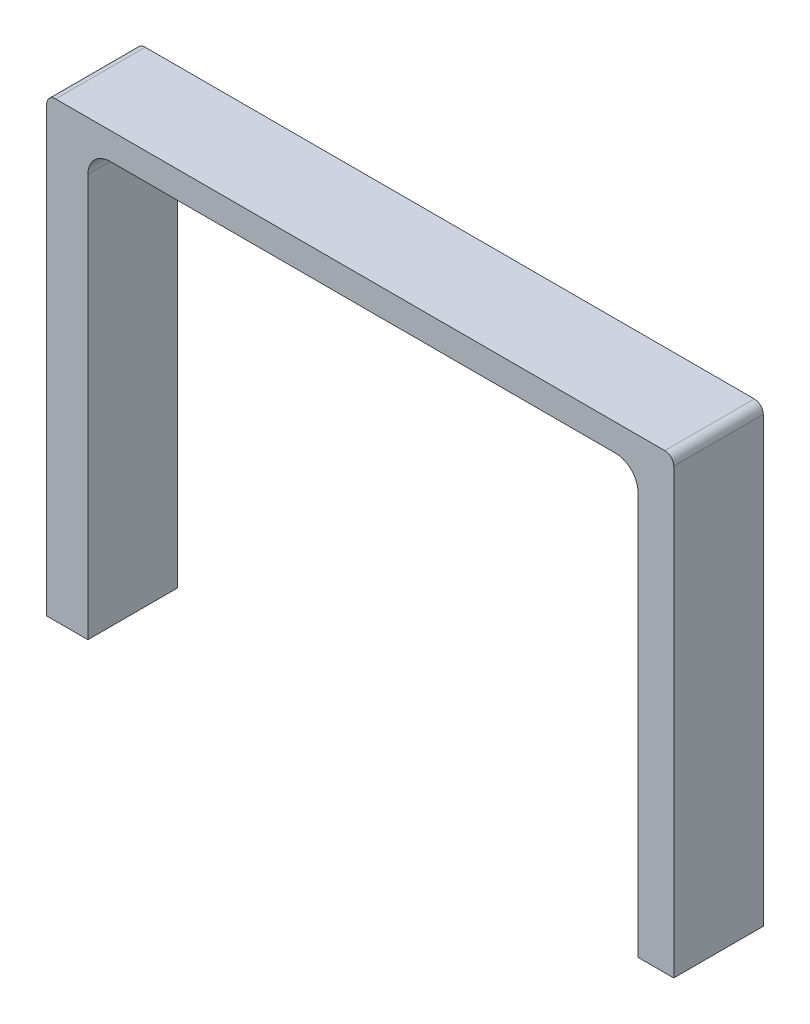
ISO-10303-21;
HEADER;
FILE_DESCRIPTION(('STEP AP214'),'2;1');
FILE_NAME('part.step','',(''),(''),'','','');
FILE_SCHEMA(('AUTOMOTIVE_DESIGN { 1 0 10303 214 1 1 1 1 }'));
ENDSEC;
DATA;
#1=APPLICATION_CONTEXT('core data for automotive mechanical design processes');
#2=APPLICATION_PROTOCOL_DEFINITION('international standard','automotive_design',2000,#1);
#3=PRODUCT_CONTEXT('',#1,'mechanical');
#4=PRODUCT('Part','Part','',(#3));
#5=PRODUCT_RELATED_PRODUCT_CATEGORY('part','',(#4));
#6=PRODUCT_DEFINITION_FORMATION('','',#4);
#7=PRODUCT_DEFINITION_CONTEXT('part definition',#1,'design');
#8=PRODUCT_DEFINITION('design','',#6,#7);
#9=PRODUCT_DEFINITION_SHAPE('','',#8);
#10=(LENGTH_UNIT() NAMED_UNIT(*) SI_UNIT(.MILLI.,.METRE.));
#11=(NAMED_UNIT(*) PLANE_ANGLE_UNIT() SI_UNIT($,.RADIAN.));
#12=(NAMED_UNIT(*) SI_UNIT($,.STERADIAN.) SOLID_ANGLE_UNIT());
#13=UNCERTAINTY_MEASURE_WITH_UNIT(LENGTH_MEASURE(1.E-05),#10,'distance_accuracy_value','');
#14=(GEOMETRIC_REPRESENTATION_CONTEXT(3) GLOBAL_UNCERTAINTY_ASSIGNED_CONTEXT((#13)) GLOBAL_UNIT_ASSIGNED_CONTEXT((#10,
#11,#12)) REPRESENTATION_CONTEXT('',''));
#15=CARTESIAN_POINT('',(0.,0.,0.));
#16=DIRECTION('',(0.,0.,1.));
#17=DIRECTION('',(1.,0.,0.));
#18=AXIS2_PLACEMENT_3D('',#15,#16,#17);
#19=CARTESIAN_POINT('',(88.9254,64.135,25.4));
#20=DIRECTION('',(-1.,0.,0.));
#21=DIRECTION('',(0.,-1.,0.));
#22=AXIS2_PLACEMENT_3D('',#19,#20,#21);
#23=PLANE('',#22);
#24=DIRECTION('',(0.,1.,0.));
#25=VECTOR('',#24,1.);
#26=CARTESIAN_POINT('',(88.9254,64.135,0.));
#27=LINE('',#26,#25);
#28=CARTESIAN_POINT('',(88.9254,-64.135,0.));
#29=VERTEX_POINT('',#28);
#30=CARTESIAN_POINT('',(88.9254,61.595,0.));
#31=VERTEX_POINT('',#30);
#32=EDGE_CURVE('E166',#29,#31,#27,.T.);
#33=ORIENTED_EDGE('',*,*,#32,.T.);
#34=DIRECTION('',(0.,0.,-1.));
#35=VECTOR('',#34,1.);
#36=CARTESIAN_POINT('',(88.9254,61.595,25.4));
#37=LINE('',#36,#35);
#38=CARTESIAN_POINT('',(88.9254,61.595,25.4));
#39=VERTEX_POINT('',#38);
#40=EDGE_CURVE('E11',#31,#39,#37,.F.);
#41=ORIENTED_EDGE('',*,*,#40,.T.);
#42=DIRECTION('',(0.,1.,0.));
#43=VECTOR('',#42,1.);
#44=CARTESIAN_POINT('',(88.9254,64.135,25.4));
#45=LINE('',#44,#43);
#46=CARTESIAN_POINT('',(88.9254,-64.135,25.4));
#47=VERTEX_POINT('',#46);
#48=EDGE_CURVE('E183',#47,#39,#45,.T.);
#49=ORIENTED_EDGE('',*,*,#48,.F.);
#50=DIRECTION('',(0.,0.,-1.));
#51=VECTOR('',#50,1.);
#52=CARTESIAN_POINT('',(88.9254,-64.135,25.4));
#53=LINE('',#52,#51);
#54=EDGE_CURVE('E165',#47,#29,#53,.T.);
#55=ORIENTED_EDGE('',*,*,#54,.T.);
#56=EDGE_LOOP('',(#33,#41,#49,#55));
#57=FACE_BOUND('',#56,.T.);
#58=ADVANCED_FACE('F37',(#57),#23,.F.);
#59=CARTESIAN_POINT('',(-88.9254,64.135,25.4));
#60=DIRECTION('',(0.,-1.,0.));
#61=DIRECTION('',(0.,0.,-1.));
#62=AXIS2_PLACEMENT_3D('',#59,#60,#61);
#63=PLANE('',#62);
#64=DIRECTION('',(-1.,0.,0.));
#65=VECTOR('',#64,1.);
#66=CARTESIAN_POINT('',(-88.9254,64.135,0.));
#67=LINE('',#66,#65);
#68=CARTESIAN_POINT('',(86.3854,64.135,0.));
#69=VERTEX_POINT('',#68);
#70=CARTESIAN_POINT('',(-86.3854,64.135,0.));
#71=VERTEX_POINT('',#70);
#72=EDGE_CURVE('E168',#69,#71,#67,.T.);
#73=ORIENTED_EDGE('',*,*,#72,.T.);
#74=DIRECTION('',(0.,0.,-1.));
#75=VECTOR('',#74,1.);
#76=CARTESIAN_POINT('',(-86.3854,64.135,25.4));
#77=LINE('',#76,#75);
#78=CARTESIAN_POINT('',(-86.3854,64.135,25.4));
#79=VERTEX_POINT('',#78);
#80=EDGE_CURVE('E58',#71,#79,#77,.F.);
#81=ORIENTED_EDGE('',*,*,#80,.T.);
#82=DIRECTION('',(-1.,0.,0.));
#83=VECTOR('',#82,1.);
#84=CARTESIAN_POINT('',(-88.9254,64.135,25.4));
#85=LINE('',#84,#83);
#86=CARTESIAN_POINT('',(86.3854,64.135,25.4));
#87=VERTEX_POINT('',#86);
#88=EDGE_CURVE('E138',#87,#79,#85,.T.);
#89=ORIENTED_EDGE('',*,*,#88,.F.);
#90=DIRECTION('',(0.,0.,-1.));
#91=VECTOR('',#90,1.);
#92=CARTESIAN_POINT('',(86.3854,64.135,25.4));
#93=LINE('',#92,#91);
#94=EDGE_CURVE('E213',#87,#69,#93,.T.);
#95=ORIENTED_EDGE('',*,*,#94,.T.);
#96=EDGE_LOOP('',(#73,#81,#89,#95));
#97=FACE_BOUND('',#96,.T.);
#98=ADVANCED_FACE('F221',(#97),#63,.F.);
#99=CARTESIAN_POINT('',(-88.9254,64.135,25.4));
#100=DIRECTION('',(1.,0.,0.));
#101=DIRECTION('',(0.,1.,0.));
#102=AXIS2_PLACEMENT_3D('',#99,#100,#101);
#103=PLANE('',#102);
#104=DIRECTION('',(0.,-1.,0.));
#105=VECTOR('',#104,1.);
#106=CARTESIAN_POINT('',(-88.9254,64.135,25.4));
#107=LINE('',#106,#105);
#108=CARTESIAN_POINT('',(-88.9254,61.595,25.4));
#109=VERTEX_POINT('',#108);
#110=CARTESIAN_POINT('',(-88.9254,-64.135,25.4));
#111=VERTEX_POINT('',#110);
#112=EDGE_CURVE('E127',#109,#111,#107,.T.);
#113=ORIENTED_EDGE('',*,*,#112,.F.);
#114=DIRECTION('',(0.,0.,-1.));
#115=VECTOR('',#114,1.);
#116=CARTESIAN_POINT('',(-88.9254,61.595,25.4));
#117=LINE('',#116,#115);
#118=CARTESIAN_POINT('',(-88.9254,61.595,0.));
#119=VERTEX_POINT('',#118);
#120=EDGE_CURVE('E207',#109,#119,#117,.T.);
#121=ORIENTED_EDGE('',*,*,#120,.T.);
#122=DIRECTION('',(0.,-1.,0.));
#123=VECTOR('',#122,1.);
#124=CARTESIAN_POINT('',(-88.9254,64.135,0.));
#125=LINE('',#124,#123);
#126=CARTESIAN_POINT('',(-88.9254,-64.135,0.));
#127=VERTEX_POINT('',#126);
#128=EDGE_CURVE('E144',#119,#127,#125,.T.);
#129=ORIENTED_EDGE('',*,*,#128,.T.);
#130=DIRECTION('',(0.,0.,-1.));
#131=VECTOR('',#130,1.);
#132=CARTESIAN_POINT('',(-88.9254,-64.135,25.4));
#133=LINE('',#132,#131);
#134=EDGE_CURVE('E141',#111,#127,#133,.T.);
#135=ORIENTED_EDGE('',*,*,#134,.F.);
#136=EDGE_LOOP('',(#113,#121,#129,#135));
#137=FACE_BOUND('',#136,.T.);
#138=ADVANCED_FACE('F142',(#137),#103,.F.);
#139=CARTESIAN_POINT('',(-88.9254,-64.135,25.4));
#140=DIRECTION('',(0.,1.,0.));
#141=DIRECTION('',(-1.,0.,0.));
#142=AXIS2_PLACEMENT_3D('',#139,#140,#141);
#143=PLANE('',#142);
#144=DIRECTION('',(1.,0.,0.));
#145=VECTOR('',#144,1.);
#146=CARTESIAN_POINT('',(-88.9254,-64.135,0.));
#147=LINE('',#146,#145);
#148=CARTESIAN_POINT('',(-77.2414,-64.135,0.));
#149=VERTEX_POINT('',#148);
#150=EDGE_CURVE('E171',#127,#149,#147,.T.);
#151=ORIENTED_EDGE('',*,*,#150,.T.);
#152=DIRECTION('',(0.,0.,-1.));
#153=VECTOR('',#152,1.);
#154=CARTESIAN_POINT('',(-77.2414,-64.135,25.4));
#155=LINE('',#154,#153);
#156=CARTESIAN_POINT('',(-77.2414,-64.135,25.4));
#157=VERTEX_POINT('',#156);
#158=EDGE_CURVE('E148',#157,#149,#155,.T.);
#159=ORIENTED_EDGE('',*,*,#158,.F.);
#160=DIRECTION('',(1.,0.,0.));
#161=VECTOR('',#160,1.);
#162=CARTESIAN_POINT('',(-88.9254,-64.135,25.4));
#163=LINE('',#162,#161);
#164=EDGE_CURVE('E132',#111,#157,#163,.T.);
#165=ORIENTED_EDGE('',*,*,#164,.F.);
#166=ORIENTED_EDGE('',*,*,#134,.T.);
#167=EDGE_LOOP('',(#151,#159,#165,#166));
#168=FACE_BOUND('',#167,.T.);
#169=ADVANCED_FACE('F150',(#168),#143,.F.);
#170=CARTESIAN_POINT('',(-77.2414,56.515,25.4));
#171=DIRECTION('',(-1.,0.,0.));
#172=DIRECTION('',(0.,-1.,0.));
#173=AXIS2_PLACEMENT_3D('',#170,#171,#172);
#174=PLANE('',#173);
#175=DIRECTION('',(0.,1.,0.));
#176=VECTOR('',#175,1.);
#177=CARTESIAN_POINT('',(-77.2414,56.515,0.));
#178=LINE('',#177,#176);
#179=CARTESIAN_POINT('',(-77.2414,50.165,0.));
#180=VERTEX_POINT('',#179);
#181=EDGE_CURVE('E173',#149,#180,#178,.T.);
#182=ORIENTED_EDGE('',*,*,#181,.T.);
#183=DIRECTION('',(0.,0.,-1.));
#184=VECTOR('',#183,1.);
#185=CARTESIAN_POINT('',(-77.2414,50.165,25.4));
#186=LINE('',#185,#184);
#187=CARTESIAN_POINT('',(-77.2414,50.165,25.4));
#188=VERTEX_POINT('',#187);
#189=EDGE_CURVE('E194',#180,#188,#186,.F.);
#190=ORIENTED_EDGE('',*,*,#189,.T.);
#191=DIRECTION('',(0.,1.,0.));
#192=VECTOR('',#191,1.);
#193=CARTESIAN_POINT('',(-77.2414,56.515,25.4));
#194=LINE('',#193,#192);
#195=EDGE_CURVE('E153',#157,#188,#194,.T.);
#196=ORIENTED_EDGE('',*,*,#195,.F.);
#197=ORIENTED_EDGE('',*,*,#158,.T.);
#198=EDGE_LOOP('',(#182,#190,#196,#197));
#199=FACE_BOUND('',#198,.T.);
#200=ADVANCED_FACE('F252',(#199),#174,.F.);
#201=CARTESIAN_POINT('',(78.7654,56.515,25.4));
#202=DIRECTION('',(0.,1.,0.));
#203=DIRECTION('',(-1.,0.,0.));
#204=AXIS2_PLACEMENT_3D('',#201,#202,#203);
#205=PLANE('',#204);
#206=DIRECTION('',(1.,0.,0.));
#207=VECTOR('',#206,1.);
#208=CARTESIAN_POINT('',(78.7654,56.515,25.4));
#209=LINE('',#208,#207);
#210=CARTESIAN_POINT('',(-70.8914,56.515,25.4));
#211=VERTEX_POINT('',#210);
#212=CARTESIAN_POINT('',(72.4154,56.515,25.4));
#213=VERTEX_POINT('',#212);
#214=EDGE_CURVE('E155',#211,#213,#209,.T.);
#215=ORIENTED_EDGE('',*,*,#214,.F.);
#216=DIRECTION('',(0.,0.,-1.));
#217=VECTOR('',#216,1.);
#218=CARTESIAN_POINT('',(-70.8914,56.515,0.));
#219=LINE('',#218,#217);
#220=CARTESIAN_POINT('',(-70.8914,56.515,0.));
#221=VERTEX_POINT('',#220);
#222=EDGE_CURVE('E191',#211,#221,#219,.T.);
#223=ORIENTED_EDGE('',*,*,#222,.T.);
#224=DIRECTION('',(1.,0.,0.));
#225=VECTOR('',#224,1.);
#226=CARTESIAN_POINT('',(78.7654,56.515,0.));
#227=LINE('',#226,#225);
#228=CARTESIAN_POINT('',(72.4154,56.515,0.));
#229=VERTEX_POINT('',#228);
#230=EDGE_CURVE('E176',#221,#229,#227,.T.);
#231=ORIENTED_EDGE('',*,*,#230,.T.);
#232=DIRECTION('',(0.,0.,-1.));
#233=VECTOR('',#232,1.);
#234=CARTESIAN_POINT('',(72.4154,56.515,25.4));
#235=LINE('',#234,#233);
#236=EDGE_CURVE('E147',#229,#213,#235,.F.);
#237=ORIENTED_EDGE('',*,*,#236,.T.);
#238=EDGE_LOOP('',(#215,#223,#231,#237));
#239=FACE_BOUND('',#238,.T.);
#240=ADVANCED_FACE('F244',(#239),#205,.F.);
#241=CARTESIAN_POINT('',(78.7654,56.515,25.4));
#242=DIRECTION('',(1.,0.,0.));
#243=DIRECTION('',(0.,1.,0.));
#244=AXIS2_PLACEMENT_3D('',#241,#242,#243);
#245=PLANE('',#244);
#246=DIRECTION('',(0.,-1.,0.));
#247=VECTOR('',#246,1.);
#248=CARTESIAN_POINT('',(78.7654,56.515,25.4));
#249=LINE('',#248,#247);
#250=CARTESIAN_POINT('',(78.7654,50.165,25.4));
#251=VERTEX_POINT('',#250);
#252=CARTESIAN_POINT('',(78.7654,-64.135,25.4));
#253=VERTEX_POINT('',#252);
#254=EDGE_CURVE('E161',#251,#253,#249,.T.);
#255=ORIENTED_EDGE('',*,*,#254,.F.);
#256=DIRECTION('',(0.,0.,-1.));
#257=VECTOR('',#256,1.);
#258=CARTESIAN_POINT('',(78.7654,50.165,0.));
#259=LINE('',#258,#257);
#260=CARTESIAN_POINT('',(78.7654,50.165,0.));
#261=VERTEX_POINT('',#260);
#262=EDGE_CURVE('E196',#251,#261,#259,.T.);
#263=ORIENTED_EDGE('',*,*,#262,.T.);
#264=DIRECTION('',(0.,-1.,0.));
#265=VECTOR('',#264,1.);
#266=CARTESIAN_POINT('',(78.7654,56.515,0.));
#267=LINE('',#266,#265);
#268=CARTESIAN_POINT('',(78.7654,-64.135,0.));
#269=VERTEX_POINT('',#268);
#270=EDGE_CURVE('E179',#261,#269,#267,.T.);
#271=ORIENTED_EDGE('',*,*,#270,.T.);
#272=DIRECTION('',(0.,0.,-1.));
#273=VECTOR('',#272,1.);
#274=CARTESIAN_POINT('',(78.7654,-64.135,25.4));
#275=LINE('',#274,#273);
#276=EDGE_CURVE('E186',#253,#269,#275,.T.);
#277=ORIENTED_EDGE('',*,*,#276,.F.);
#278=EDGE_LOOP('',(#255,#263,#271,#277));
#279=FACE_BOUND('',#278,.T.);
#280=ADVANCED_FACE('F236',(#279),#245,.F.);
#281=CARTESIAN_POINT('',(78.7654,-64.135,25.4));
#282=DIRECTION('',(0.,1.,0.));
#283=DIRECTION('',(0.,0.,1.));
#284=AXIS2_PLACEMENT_3D('',#281,#282,#283);
#285=PLANE('',#284);
#286=DIRECTION('',(1.,0.,0.));
#287=VECTOR('',#286,1.);
#288=CARTESIAN_POINT('',(78.7654,-64.135,0.));
#289=LINE('',#288,#287);
#290=EDGE_CURVE('E181',#269,#29,#289,.T.);
#291=ORIENTED_EDGE('',*,*,#290,.T.);
#292=ORIENTED_EDGE('',*,*,#54,.F.);
#293=DIRECTION('',(1.,0.,0.));
#294=VECTOR('',#293,1.);
#295=CARTESIAN_POINT('',(78.7654,-64.135,25.4));
#296=LINE('',#295,#294);
#297=EDGE_CURVE('E163',#253,#47,#296,.T.);
#298=ORIENTED_EDGE('',*,*,#297,.F.);
#299=ORIENTED_EDGE('',*,*,#276,.T.);
#300=EDGE_LOOP('',(#291,#292,#298,#299));
#301=FACE_BOUND('',#300,.T.);
#302=ADVANCED_FACE('F230',(#301),#285,.F.);
#303=CARTESIAN_POINT('',(0.,0.,25.4));
#304=DIRECTION('',(0.,0.,1.));
#305=DIRECTION('',(1.,0.,0.));
#306=AXIS2_PLACEMENT_3D('',#303,#304,#305);
#307=PLANE('',#306);
#308=ORIENTED_EDGE('',*,*,#88,.T.);
#309=CARTESIAN_POINT('',(-86.3854,61.595,25.4));
#310=DIRECTION('',(0.,0.,1.));
#311=DIRECTION('',(1.,0.,0.));
#312=AXIS2_PLACEMENT_3D('',#309,#310,#311);
#313=CIRCLE('',#312,2.54);
#314=EDGE_CURVE('E45',#79,#109,#313,.T.);
#315=ORIENTED_EDGE('',*,*,#314,.T.);
#316=ORIENTED_EDGE('',*,*,#112,.T.);
#317=ORIENTED_EDGE('',*,*,#164,.T.);
#318=ORIENTED_EDGE('',*,*,#195,.T.);
#319=CARTESIAN_POINT('',(-70.8914,50.165,25.4));
#320=DIRECTION('',(0.,0.,1.));
#321=DIRECTION('',(1.,0.,0.));
#322=AXIS2_PLACEMENT_3D('',#319,#320,#321);
#323=CIRCLE('',#322,6.35);
#324=EDGE_CURVE('E201',#188,#211,#323,.F.);
#325=ORIENTED_EDGE('',*,*,#324,.T.);
#326=ORIENTED_EDGE('',*,*,#214,.T.);
#327=CARTESIAN_POINT('',(72.4154,50.165,25.4));
#328=DIRECTION('',(0.,0.,1.));
#329=DIRECTION('',(1.,0.,0.));
#330=AXIS2_PLACEMENT_3D('',#327,#328,#329);
#331=CIRCLE('',#330,6.35);
#332=EDGE_CURVE('E205',#213,#251,#331,.F.);
#333=ORIENTED_EDGE('',*,*,#332,.T.);
#334=ORIENTED_EDGE('',*,*,#254,.T.);
#335=ORIENTED_EDGE('',*,*,#297,.T.);
#336=ORIENTED_EDGE('',*,*,#48,.T.);
#337=CARTESIAN_POINT('',(86.3854,61.595,25.4));
#338=DIRECTION('',(0.,0.,1.));
#339=DIRECTION('',(1.,0.,0.));
#340=AXIS2_PLACEMENT_3D('',#337,#338,#339);
#341=CIRCLE('',#340,2.54);
#342=EDGE_CURVE('E217',#39,#87,#341,.T.);
#343=ORIENTED_EDGE('',*,*,#342,.T.);
#344=EDGE_LOOP('',(#308,#315,#316,#317,#318,#325,#326,#333,#334,#335,#336,#343));
#345=FACE_BOUND('',#344,.T.);
#346=ADVANCED_FACE('F129',(#345),#307,.T.);
#347=CARTESIAN_POINT('',(0.,0.,0.));
#348=DIRECTION('',(0.,0.,1.));
#349=DIRECTION('',(1.,0.,0.));
#350=AXIS2_PLACEMENT_3D('',#347,#348,#349);
#351=PLANE('',#350);
#352=ORIENTED_EDGE('',*,*,#128,.F.);
#353=CARTESIAN_POINT('',(-86.3854,61.595,0.));
#354=DIRECTION('',(0.,0.,1.));
#355=DIRECTION('',(1.,0.,0.));
#356=AXIS2_PLACEMENT_3D('',#353,#354,#355);
#357=CIRCLE('',#356,2.54);
#358=EDGE_CURVE('E211',#119,#71,#357,.F.);
#359=ORIENTED_EDGE('',*,*,#358,.T.);
#360=ORIENTED_EDGE('',*,*,#72,.F.);
#361=CARTESIAN_POINT('',(86.3854,61.595,0.));
#362=DIRECTION('',(0.,0.,1.));
#363=DIRECTION('',(1.,0.,0.));
#364=AXIS2_PLACEMENT_3D('',#361,#362,#363);
#365=CIRCLE('',#364,2.54);
#366=EDGE_CURVE('E209',#69,#31,#365,.F.);
#367=ORIENTED_EDGE('',*,*,#366,.T.);
#368=ORIENTED_EDGE('',*,*,#32,.F.);
#369=ORIENTED_EDGE('',*,*,#290,.F.);
#370=ORIENTED_EDGE('',*,*,#270,.F.);
#371=CARTESIAN_POINT('',(72.4154,50.165,0.));
#372=DIRECTION('',(0.,0.,1.));
#373=DIRECTION('',(1.,0.,0.));
#374=AXIS2_PLACEMENT_3D('',#371,#372,#373);
#375=CIRCLE('',#374,6.35);
#376=EDGE_CURVE('E203',#261,#229,#375,.T.);
#377=ORIENTED_EDGE('',*,*,#376,.T.);
#378=ORIENTED_EDGE('',*,*,#230,.F.);
#379=CARTESIAN_POINT('',(-70.8914,50.165,0.));
#380=DIRECTION('',(0.,0.,1.));
#381=DIRECTION('',(1.,0.,0.));
#382=AXIS2_PLACEMENT_3D('',#379,#380,#381);
#383=CIRCLE('',#382,6.35);
#384=EDGE_CURVE('E199',#221,#180,#383,.T.);
#385=ORIENTED_EDGE('',*,*,#384,.T.);
#386=ORIENTED_EDGE('',*,*,#181,.F.);
#387=ORIENTED_EDGE('',*,*,#150,.F.);
#388=EDGE_LOOP('',(#352,#359,#360,#367,#368,#369,#370,#377,#378,#385,#386,#387));
#389=FACE_BOUND('',#388,.T.);
#390=ADVANCED_FACE('F225',(#389),#351,.F.);
#391=CARTESIAN_POINT('',(-70.8914,50.165,25.4));
#392=DIRECTION('',(0.,0.,1.));
#393=DIRECTION('',(1.,0.,0.));
#394=AXIS2_PLACEMENT_3D('',#391,#392,#393);
#395=CYLINDRICAL_SURFACE('',#394,6.35);
#396=ORIENTED_EDGE('',*,*,#324,.F.);
#397=ORIENTED_EDGE('',*,*,#189,.F.);
#398=ORIENTED_EDGE('',*,*,#384,.F.);
#399=ORIENTED_EDGE('',*,*,#222,.F.);
#400=EDGE_LOOP('',(#396,#397,#398,#399));
#401=FACE_BOUND('',#400,.T.);
#402=ADVANCED_FACE('F249',(#401),#395,.F.);
#403=CARTESIAN_POINT('',(72.4154,50.165,25.4));
#404=DIRECTION('',(0.,0.,1.));
#405=DIRECTION('',(1.,0.,0.));
#406=AXIS2_PLACEMENT_3D('',#403,#404,#405);
#407=CYLINDRICAL_SURFACE('',#406,6.35);
#408=ORIENTED_EDGE('',*,*,#332,.F.);
#409=ORIENTED_EDGE('',*,*,#236,.F.);
#410=ORIENTED_EDGE('',*,*,#376,.F.);
#411=ORIENTED_EDGE('',*,*,#262,.F.);
#412=EDGE_LOOP('',(#408,#409,#410,#411));
#413=FACE_BOUND('',#412,.T.);
#414=ADVANCED_FACE('F240',(#413),#407,.F.);
#415=CARTESIAN_POINT('',(-86.3854,61.595,25.4));
#416=DIRECTION('',(0.,0.,-1.));
#417=DIRECTION('',(-1.,0.,0.));
#418=AXIS2_PLACEMENT_3D('',#415,#416,#417);
#419=CYLINDRICAL_SURFACE('',#418,2.54);
#420=ORIENTED_EDGE('',*,*,#314,.F.);
#421=ORIENTED_EDGE('',*,*,#80,.F.);
#422=ORIENTED_EDGE('',*,*,#358,.F.);
#423=ORIENTED_EDGE('',*,*,#120,.F.);
#424=EDGE_LOOP('',(#420,#421,#422,#423));
#425=FACE_BOUND('',#424,.T.);
#426=ADVANCED_FACE('F272',(#425),#419,.T.);
#427=CARTESIAN_POINT('',(86.3854,61.595,25.4));
#428=DIRECTION('',(0.,0.,-1.));
#429=DIRECTION('',(-1.,0.,0.));
#430=AXIS2_PLACEMENT_3D('',#427,#428,#429);
#431=CYLINDRICAL_SURFACE('',#430,2.54);
#432=ORIENTED_EDGE('',*,*,#342,.F.);
#433=ORIENTED_EDGE('',*,*,#40,.F.);
#434=ORIENTED_EDGE('',*,*,#366,.F.);
#435=ORIENTED_EDGE('',*,*,#94,.F.);
#436=EDGE_LOOP('',(#432,#433,#434,#435));
#437=FACE_BOUND('',#436,.T.);
#438=ADVANCED_FACE('F39',(#437),#431,.T.);
#439=CLOSED_SHELL('',(#58,#98,#138,#169,#200,#240,#280,#302,#346,#390,#402,#414,#426,#438));
#440=MANIFOLD_SOLID_BREP('B2',#439);
#441=ADVANCED_BREP_SHAPE_REPRESENTATION('',(#18,#440),#14);
#442=SHAPE_DEFINITION_REPRESENTATION(#9,#441);
ENDSEC;
END-ISO-10303-21;
